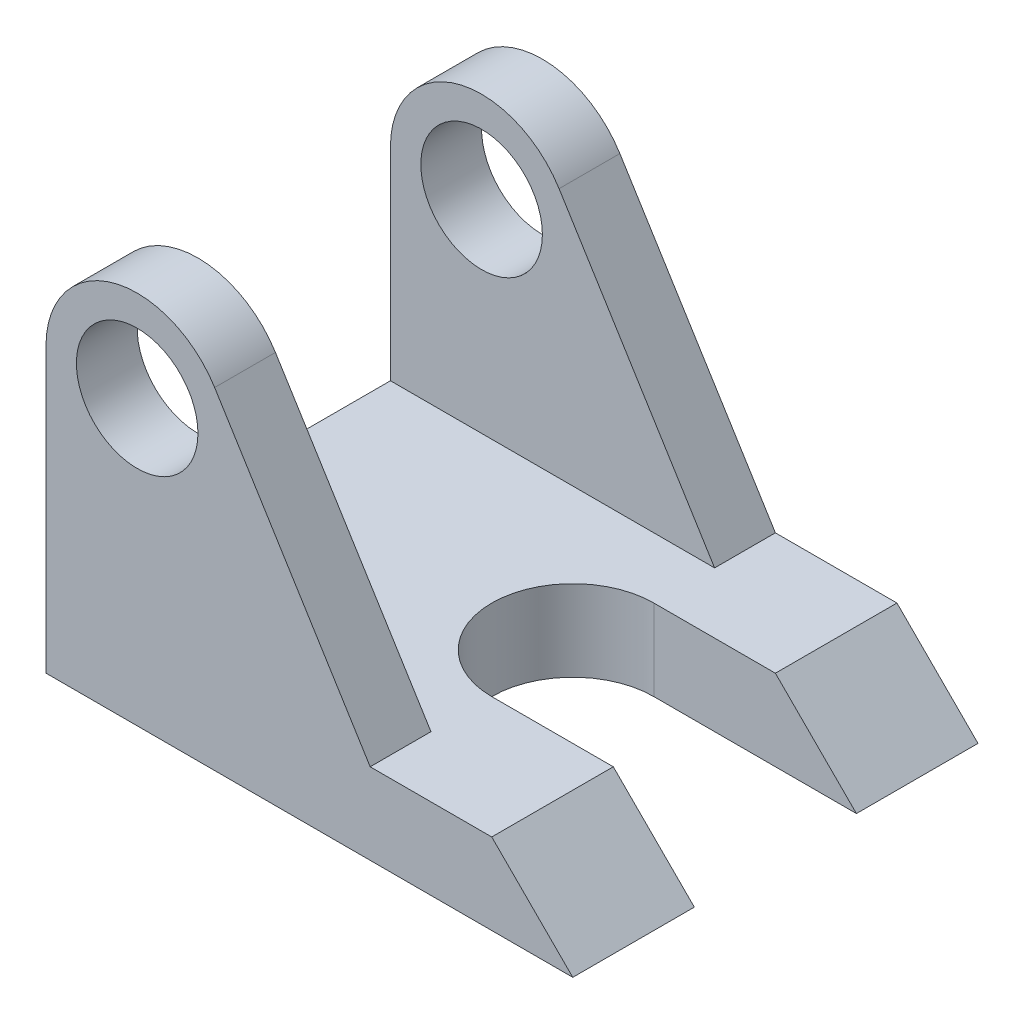
ISO-10303-21;
HEADER;
FILE_DESCRIPTION(('STEP AP214'),'2;1');
FILE_NAME('part.step','',(''),(''),'','','');
FILE_SCHEMA(('AUTOMOTIVE_DESIGN { 1 0 10303 214 1 1 1 1 }'));
ENDSEC;
DATA;
#1=APPLICATION_CONTEXT('core data for automotive mechanical design processes');
#2=APPLICATION_PROTOCOL_DEFINITION('international standard','automotive_design',2000,#1);
#3=PRODUCT_CONTEXT('',#1,'mechanical');
#4=PRODUCT('Part','Part','',(#3));
#5=PRODUCT_RELATED_PRODUCT_CATEGORY('part','',(#4));
#6=PRODUCT_DEFINITION_FORMATION('','',#4);
#7=PRODUCT_DEFINITION_CONTEXT('part definition',#1,'design');
#8=PRODUCT_DEFINITION('design','',#6,#7);
#9=PRODUCT_DEFINITION_SHAPE('','',#8);
#10=(LENGTH_UNIT() NAMED_UNIT(*) SI_UNIT(.MILLI.,.METRE.));
#11=(NAMED_UNIT(*) PLANE_ANGLE_UNIT() SI_UNIT($,.RADIAN.));
#12=(NAMED_UNIT(*) SI_UNIT($,.STERADIAN.) SOLID_ANGLE_UNIT());
#13=UNCERTAINTY_MEASURE_WITH_UNIT(LENGTH_MEASURE(1.E-05),#10,'distance_accuracy_value','');
#14=(GEOMETRIC_REPRESENTATION_CONTEXT(3) GLOBAL_UNCERTAINTY_ASSIGNED_CONTEXT((#13)) GLOBAL_UNIT_ASSIGNED_CONTEXT((#10,
#11,#12)) REPRESENTATION_CONTEXT('',''));
#15=CARTESIAN_POINT('',(0.,0.,0.));
#16=DIRECTION('',(0.,0.,1.));
#17=DIRECTION('',(1.,0.,0.));
#18=AXIS2_PLACEMENT_3D('',#15,#16,#17);
#19=CARTESIAN_POINT('',(0.,0.,50.));
#20=DIRECTION('',(0.,-1.,0.));
#21=DIRECTION('',(1.,0.,0.));
#22=AXIS2_PLACEMENT_3D('',#19,#20,#21);
#23=PLANE('',#22);
#24=DIRECTION('',(-1.,0.,0.));
#25=VECTOR('',#24,1.);
#26=CARTESIAN_POINT('',(0.,0.,20.));
#27=LINE('',#26,#25);
#28=CARTESIAN_POINT('',(130.,0.,20.));
#29=VERTEX_POINT('',#28);
#30=CARTESIAN_POINT('',(80.,0.,20.));
#31=VERTEX_POINT('',#30);
#32=EDGE_CURVE('E74',#29,#31,#27,.T.);
#33=ORIENTED_EDGE('',*,*,#32,.F.);
#34=DIRECTION('',(0.,0.,-1.));
#35=VECTOR('',#34,1.);
#36=CARTESIAN_POINT('',(130.,0.,50.));
#37=LINE('',#36,#35);
#38=CARTESIAN_POINT('',(130.,0.,50.));
#39=VERTEX_POINT('',#38);
#40=EDGE_CURVE('E238',#39,#29,#37,.T.);
#41=ORIENTED_EDGE('',*,*,#40,.F.);
#42=DIRECTION('',(-1.,0.,0.));
#43=VECTOR('',#42,1.);
#44=CARTESIAN_POINT('',(0.,0.,50.));
#45=LINE('',#44,#43);
#46=CARTESIAN_POINT('',(0.,0.,50.));
#47=VERTEX_POINT('',#46);
#48=EDGE_CURVE('E217',#39,#47,#45,.T.);
#49=ORIENTED_EDGE('',*,*,#48,.T.);
#50=DIRECTION('',(0.,0.,-1.));
#51=VECTOR('',#50,1.);
#52=CARTESIAN_POINT('',(0.,0.,50.));
#53=LINE('',#52,#51);
#54=CARTESIAN_POINT('',(0.,0.,-50.));
#55=VERTEX_POINT('',#54);
#56=EDGE_CURVE('E241',#47,#55,#53,.T.);
#57=ORIENTED_EDGE('',*,*,#56,.T.);
#58=DIRECTION('',(-1.,0.,0.));
#59=VECTOR('',#58,1.);
#60=CARTESIAN_POINT('',(0.,0.,-50.));
#61=LINE('',#60,#59);
#62=CARTESIAN_POINT('',(130.,0.,-50.));
#63=VERTEX_POINT('',#62);
#64=EDGE_CURVE('E226',#63,#55,#61,.T.);
#65=ORIENTED_EDGE('',*,*,#64,.F.);
#66=CARTESIAN_POINT('',(130.,0.,-20.));
#67=VERTEX_POINT('',#66);
#68=EDGE_CURVE('E237',#67,#63,#37,.T.);
#69=ORIENTED_EDGE('',*,*,#68,.F.);
#70=DIRECTION('',(1.,0.,0.));
#71=VECTOR('',#70,1.);
#72=CARTESIAN_POINT('',(0.,0.,-20.));
#73=LINE('',#72,#71);
#74=CARTESIAN_POINT('',(80.,0.,-20.));
#75=VERTEX_POINT('',#74);
#76=EDGE_CURVE('E257',#75,#67,#73,.T.);
#77=ORIENTED_EDGE('',*,*,#76,.F.);
#78=CARTESIAN_POINT('',(80.,0.,0.));
#79=DIRECTION('',(0.,-1.,0.));
#80=DIRECTION('',(0.,0.,-1.));
#81=AXIS2_PLACEMENT_3D('',#78,#79,#80);
#82=CIRCLE('',#81,20.);
#83=EDGE_CURVE('E45',#75,#31,#82,.F.);
#84=ORIENTED_EDGE('',*,*,#83,.T.);
#85=EDGE_LOOP('',(#33,#41,#49,#57,#65,#69,#77,#84));
#86=FACE_BOUND('',#85,.T.);
#87=ADVANCED_FACE('F41',(#86),#23,.T.);
#88=CARTESIAN_POINT('',(64.9999999999999,65.,50.));
#89=DIRECTION('',(0.707106781186547,0.707106781186548,0.));
#90=DIRECTION('',(-0.707106781186548,0.707106781186547,0.));
#91=AXIS2_PLACEMENT_3D('',#88,#89,#90);
#92=PLANE('',#91);
#93=DIRECTION('',(0.707106781186548,-0.707106781186547,0.));
#94=VECTOR('',#93,1.);
#95=CARTESIAN_POINT('',(64.9999999999999,65.,20.));
#96=LINE('',#95,#94);
#97=CARTESIAN_POINT('',(110.,20.,20.));
#98=VERTEX_POINT('',#97);
#99=EDGE_CURVE('E252',#98,#29,#96,.T.);
#100=ORIENTED_EDGE('',*,*,#99,.F.);
#101=DIRECTION('',(0.,0.,-1.));
#102=VECTOR('',#101,1.);
#103=CARTESIAN_POINT('',(110.,20.,50.));
#104=LINE('',#103,#102);
#105=CARTESIAN_POINT('',(110.,20.,50.));
#106=VERTEX_POINT('',#105);
#107=EDGE_CURVE('E234',#106,#98,#104,.T.);
#108=ORIENTED_EDGE('',*,*,#107,.F.);
#109=DIRECTION('',(0.707106781186548,-0.707106781186547,0.));
#110=VECTOR('',#109,1.);
#111=CARTESIAN_POINT('',(64.9999999999999,65.,50.));
#112=LINE('',#111,#110);
#113=EDGE_CURVE('E221',#106,#39,#112,.T.);
#114=ORIENTED_EDGE('',*,*,#113,.T.);
#115=ORIENTED_EDGE('',*,*,#40,.T.);
#116=EDGE_LOOP('',(#100,#108,#114,#115));
#117=FACE_BOUND('',#116,.T.);
#118=ADVANCED_FACE('F255',(#117),#92,.T.);
#119=CARTESIAN_POINT('',(0.,20.,50.));
#120=DIRECTION('',(0.,1.,0.));
#121=DIRECTION('',(0.,0.,1.));
#122=AXIS2_PLACEMENT_3D('',#119,#120,#121);
#123=PLANE('',#122);
#124=DIRECTION('',(1.,0.,0.));
#125=VECTOR('',#124,1.);
#126=CARTESIAN_POINT('',(0.,20.,20.));
#127=LINE('',#126,#125);
#128=CARTESIAN_POINT('',(80.,20.,20.));
#129=VERTEX_POINT('',#128);
#130=EDGE_CURVE('E11',#129,#98,#127,.T.);
#131=ORIENTED_EDGE('',*,*,#130,.F.);
#132=CARTESIAN_POINT('',(80.,20.,0.));
#133=DIRECTION('',(0.,1.,0.));
#134=DIRECTION('',(0.,0.,1.));
#135=AXIS2_PLACEMENT_3D('',#132,#133,#134);
#136=CIRCLE('',#135,20.);
#137=CARTESIAN_POINT('',(80.,20.,-20.));
#138=VERTEX_POINT('',#137);
#139=EDGE_CURVE('E79',#129,#138,#136,.F.);
#140=ORIENTED_EDGE('',*,*,#139,.T.);
#141=DIRECTION('',(-1.,0.,0.));
#142=VECTOR('',#141,1.);
#143=CARTESIAN_POINT('',(0.,20.,-20.));
#144=LINE('',#143,#142);
#145=CARTESIAN_POINT('',(110.,20.,-20.));
#146=VERTEX_POINT('',#145);
#147=EDGE_CURVE('E51',#146,#138,#144,.T.);
#148=ORIENTED_EDGE('',*,*,#147,.F.);
#149=CARTESIAN_POINT('',(110.,20.,-50.));
#150=VERTEX_POINT('',#149);
#151=EDGE_CURVE('E157',#146,#150,#104,.T.);
#152=ORIENTED_EDGE('',*,*,#151,.T.);
#153=DIRECTION('',(1.,0.,0.));
#154=VECTOR('',#153,1.);
#155=CARTESIAN_POINT('',(0.,20.,-50.));
#156=LINE('',#155,#154);
#157=CARTESIAN_POINT('',(80.,20.,-50.));
#158=VERTEX_POINT('',#157);
#159=EDGE_CURVE('E218',#158,#150,#156,.T.);
#160=ORIENTED_EDGE('',*,*,#159,.F.);
#161=DIRECTION('',(0.,0.,1.));
#162=VECTOR('',#161,1.);
#163=CARTESIAN_POINT('',(80.,20.,-50.));
#164=LINE('',#163,#162);
#165=CARTESIAN_POINT('',(80.,20.,-35.));
#166=VERTEX_POINT('',#165);
#167=EDGE_CURVE('E211',#158,#166,#164,.T.);
#168=ORIENTED_EDGE('',*,*,#167,.T.);
#169=DIRECTION('',(1.,0.,0.));
#170=VECTOR('',#169,1.);
#171=CARTESIAN_POINT('',(0.,20.,-35.));
#172=LINE('',#171,#170);
#173=CARTESIAN_POINT('',(0.,20.,-35.));
#174=VERTEX_POINT('',#173);
#175=EDGE_CURVE('E153',#174,#166,#172,.T.);
#176=ORIENTED_EDGE('',*,*,#175,.F.);
#177=DIRECTION('',(0.,0.,-1.));
#178=VECTOR('',#177,1.);
#179=CARTESIAN_POINT('',(0.,20.,50.));
#180=LINE('',#179,#178);
#181=CARTESIAN_POINT('',(0.,20.,35.));
#182=VERTEX_POINT('',#181);
#183=EDGE_CURVE('E145',#182,#174,#180,.T.);
#184=ORIENTED_EDGE('',*,*,#183,.F.);
#185=DIRECTION('',(1.,0.,0.));
#186=VECTOR('',#185,1.);
#187=CARTESIAN_POINT('',(0.,20.,35.));
#188=LINE('',#187,#186);
#189=CARTESIAN_POINT('',(80.,20.,35.));
#190=VERTEX_POINT('',#189);
#191=EDGE_CURVE('E150',#182,#190,#188,.T.);
#192=ORIENTED_EDGE('',*,*,#191,.T.);
#193=DIRECTION('',(0.,0.,-1.));
#194=VECTOR('',#193,1.);
#195=CARTESIAN_POINT('',(80.,20.,50.));
#196=LINE('',#195,#194);
#197=CARTESIAN_POINT('',(80.,20.,50.));
#198=VERTEX_POINT('',#197);
#199=EDGE_CURVE('E182',#198,#190,#196,.T.);
#200=ORIENTED_EDGE('',*,*,#199,.F.);
#201=DIRECTION('',(1.,0.,0.));
#202=VECTOR('',#201,1.);
#203=CARTESIAN_POINT('',(0.,20.,50.));
#204=LINE('',#203,#202);
#205=EDGE_CURVE('E158',#198,#106,#204,.T.);
#206=ORIENTED_EDGE('',*,*,#205,.T.);
#207=ORIENTED_EDGE('',*,*,#107,.T.);
#208=EDGE_LOOP('',(#131,#140,#148,#152,#160,#168,#176,#184,#192,#200,#206,#207));
#209=FACE_BOUND('',#208,.T.);
#210=ADVANCED_FACE('F148',(#209),#123,.T.);
#211=CARTESIAN_POINT('',(0.,0.,50.));
#212=DIRECTION('',(-1.,0.,0.));
#213=DIRECTION('',(0.,0.,1.));
#214=AXIS2_PLACEMENT_3D('',#211,#212,#213);
#215=PLANE('',#214);
#216=DIRECTION('',(0.,1.,0.));
#217=VECTOR('',#216,1.);
#218=CARTESIAN_POINT('',(0.,0.,-50.));
#219=LINE('',#218,#217);
#220=CARTESIAN_POINT('',(0.,70.,-50.));
#221=VERTEX_POINT('',#220);
#222=EDGE_CURVE('E210',#55,#221,#219,.T.);
#223=ORIENTED_EDGE('',*,*,#222,.F.);
#224=ORIENTED_EDGE('',*,*,#56,.F.);
#225=DIRECTION('',(0.,1.,0.));
#226=VECTOR('',#225,1.);
#227=CARTESIAN_POINT('',(0.,0.,50.));
#228=LINE('',#227,#226);
#229=CARTESIAN_POINT('',(0.,70.,50.));
#230=VERTEX_POINT('',#229);
#231=EDGE_CURVE('E215',#47,#230,#228,.T.);
#232=ORIENTED_EDGE('',*,*,#231,.T.);
#233=DIRECTION('',(0.,0.,-1.));
#234=VECTOR('',#233,1.);
#235=CARTESIAN_POINT('',(0.,70.,50.));
#236=LINE('',#235,#234);
#237=CARTESIAN_POINT('',(0.,70.,35.));
#238=VERTEX_POINT('',#237);
#239=EDGE_CURVE('E171',#230,#238,#236,.T.);
#240=ORIENTED_EDGE('',*,*,#239,.T.);
#241=DIRECTION('',(0.,1.,0.));
#242=VECTOR('',#241,1.);
#243=CARTESIAN_POINT('',(0.,0.,35.));
#244=LINE('',#243,#242);
#245=EDGE_CURVE('E165',#182,#238,#244,.T.);
#246=ORIENTED_EDGE('',*,*,#245,.F.);
#247=ORIENTED_EDGE('',*,*,#183,.T.);
#248=DIRECTION('',(0.,1.,0.));
#249=VECTOR('',#248,1.);
#250=CARTESIAN_POINT('',(0.,0.,-35.));
#251=LINE('',#250,#249);
#252=CARTESIAN_POINT('',(0.,70.,-35.));
#253=VERTEX_POINT('',#252);
#254=EDGE_CURVE('E202',#174,#253,#251,.T.);
#255=ORIENTED_EDGE('',*,*,#254,.T.);
#256=DIRECTION('',(0.,0.,1.));
#257=VECTOR('',#256,1.);
#258=CARTESIAN_POINT('',(0.,70.,-50.));
#259=LINE('',#258,#257);
#260=EDGE_CURVE('E196',#221,#253,#259,.T.);
#261=ORIENTED_EDGE('',*,*,#260,.F.);
#262=EDGE_LOOP('',(#223,#224,#232,#240,#246,#247,#255,#261));
#263=FACE_BOUND('',#262,.T.);
#264=ADVANCED_FACE('F43',(#263),#215,.T.);
#265=DIRECTION('',(-0.707106781186548,0.707106781186547,0.));
#266=VECTOR('',#265,1.);
#267=CARTESIAN_POINT('',(64.9999999999999,65.,-20.));
#268=LINE('',#267,#266);
#269=EDGE_CURVE('E247',#67,#146,#268,.T.);
#270=ORIENTED_EDGE('',*,*,#269,.F.);
#271=ORIENTED_EDGE('',*,*,#68,.T.);
#272=DIRECTION('',(0.707106781186548,-0.707106781186547,0.));
#273=VECTOR('',#272,1.);
#274=CARTESIAN_POINT('',(64.9999999999999,65.,-50.));
#275=LINE('',#274,#273);
#276=EDGE_CURVE('E229',#150,#63,#275,.T.);
#277=ORIENTED_EDGE('',*,*,#276,.F.);
#278=ORIENTED_EDGE('',*,*,#151,.F.);
#279=EDGE_LOOP('',(#270,#271,#277,#278));
#280=FACE_BOUND('',#279,.T.);
#281=ADVANCED_FACE('F303',(#280),#92,.T.);
#282=CARTESIAN_POINT('',(0.,0.,50.));
#283=DIRECTION('',(0.,0.,1.));
#284=DIRECTION('',(1.,0.,0.));
#285=AXIS2_PLACEMENT_3D('',#282,#283,#284);
#286=PLANE('',#285);
#287=ORIENTED_EDGE('',*,*,#231,.F.);
#288=ORIENTED_EDGE('',*,*,#48,.F.);
#289=ORIENTED_EDGE('',*,*,#113,.F.);
#290=ORIENTED_EDGE('',*,*,#205,.F.);
#291=DIRECTION('',(0.527201409917985,-0.849740356450421,0.));
#292=VECTOR('',#291,1.);
#293=CARTESIAN_POINT('',(66.7243801501366,41.3975716511801,50.));
#294=LINE('',#293,#292);
#295=CARTESIAN_POINT('',(41.6191580201345,81.8620317231546,50.));
#296=VERTEX_POINT('',#295);
#297=EDGE_CURVE('E186',#296,#198,#294,.T.);
#298=ORIENTED_EDGE('',*,*,#297,.F.);
#299=CARTESIAN_POINT('',(22.5,70.,50.));
#300=DIRECTION('',(0.,0.,1.));
#301=DIRECTION('',(1.,0.,0.));
#302=AXIS2_PLACEMENT_3D('',#299,#300,#301);
#303=CIRCLE('',#302,22.5);
#304=EDGE_CURVE('E176',#230,#296,#303,.F.);
#305=ORIENTED_EDGE('',*,*,#304,.F.);
#306=EDGE_LOOP('',(#287,#288,#289,#290,#298,#305));
#307=FACE_BOUND('',#306,.T.);
#308=CARTESIAN_POINT('',(22.5,70.,50.));
#309=DIRECTION('',(0.,0.,1.));
#310=DIRECTION('',(1.,0.,0.));
#311=AXIS2_PLACEMENT_3D('',#308,#309,#310);
#312=CIRCLE('',#311,15.);
#313=CARTESIAN_POINT('',(37.5,70.,50.));
#314=VERTEX_POINT('',#313);
#315=EDGE_CURVE('E173',#314,#314,#312,.T.);
#316=ORIENTED_EDGE('',*,*,#315,.F.);
#317=EDGE_LOOP('',(#316));
#318=FACE_BOUND('',#317,.T.);
#319=ADVANCED_FACE('F279',(#307,#318),#286,.T.);
#320=CARTESIAN_POINT('',(0.,0.,-50.));
#321=DIRECTION('',(0.,0.,1.));
#322=DIRECTION('',(1.,0.,0.));
#323=AXIS2_PLACEMENT_3D('',#320,#321,#322);
#324=PLANE('',#323);
#325=ORIENTED_EDGE('',*,*,#222,.T.);
#326=CARTESIAN_POINT('',(22.5,70.,-50.));
#327=DIRECTION('',(0.,0.,1.));
#328=DIRECTION('',(1.,0.,0.));
#329=AXIS2_PLACEMENT_3D('',#326,#327,#328);
#330=CIRCLE('',#329,22.5);
#331=CARTESIAN_POINT('',(41.6191580201345,81.8620317231546,-50.));
#332=VERTEX_POINT('',#331);
#333=EDGE_CURVE('E190',#221,#332,#330,.F.);
#334=ORIENTED_EDGE('',*,*,#333,.T.);
#335=DIRECTION('',(0.527201409917985,-0.849740356450421,0.));
#336=VECTOR('',#335,1.);
#337=CARTESIAN_POINT('',(66.7243801501366,41.3975716511801,-50.));
#338=LINE('',#337,#336);
#339=EDGE_CURVE('E194',#332,#158,#338,.T.);
#340=ORIENTED_EDGE('',*,*,#339,.T.);
#341=ORIENTED_EDGE('',*,*,#159,.T.);
#342=ORIENTED_EDGE('',*,*,#276,.T.);
#343=ORIENTED_EDGE('',*,*,#64,.T.);
#344=EDGE_LOOP('',(#325,#334,#340,#341,#342,#343));
#345=FACE_BOUND('',#344,.T.);
#346=CARTESIAN_POINT('',(22.5,70.,-50.));
#347=DIRECTION('',(0.,0.,1.));
#348=DIRECTION('',(1.,0.,0.));
#349=AXIS2_PLACEMENT_3D('',#346,#347,#348);
#350=CIRCLE('',#349,15.);
#351=CARTESIAN_POINT('',(37.5,70.,-50.));
#352=VERTEX_POINT('',#351);
#353=EDGE_CURVE('E187',#352,#352,#350,.T.);
#354=ORIENTED_EDGE('',*,*,#353,.T.);
#355=EDGE_LOOP('',(#354));
#356=FACE_BOUND('',#355,.T.);
#357=ADVANCED_FACE('F309',(#345,#356),#324,.F.);
#358=CARTESIAN_POINT('',(22.5,70.,-50.));
#359=DIRECTION('',(0.,0.,1.));
#360=DIRECTION('',(1.,0.,0.));
#361=AXIS2_PLACEMENT_3D('',#358,#359,#360);
#362=CYLINDRICAL_SURFACE('',#361,22.5);
#363=CARTESIAN_POINT('',(22.5,70.,-35.));
#364=DIRECTION('',(0.,0.,1.));
#365=DIRECTION('',(1.,0.,0.));
#366=AXIS2_PLACEMENT_3D('',#363,#364,#365);
#367=CIRCLE('',#366,22.5);
#368=CARTESIAN_POINT('',(41.6191580201345,81.8620317231546,-35.));
#369=VERTEX_POINT('',#368);
#370=EDGE_CURVE('E199',#253,#369,#367,.F.);
#371=ORIENTED_EDGE('',*,*,#370,.T.);
#372=DIRECTION('',(0.,0.,1.));
#373=VECTOR('',#372,1.);
#374=CARTESIAN_POINT('',(41.6191580201345,81.8620317231546,-50.));
#375=LINE('',#374,#373);
#376=EDGE_CURVE('E207',#332,#369,#375,.T.);
#377=ORIENTED_EDGE('',*,*,#376,.F.);
#378=ORIENTED_EDGE('',*,*,#333,.F.);
#379=ORIENTED_EDGE('',*,*,#260,.T.);
#380=EDGE_LOOP('',(#371,#377,#378,#379));
#381=FACE_BOUND('',#380,.T.);
#382=ADVANCED_FACE('F312',(#381),#362,.T.);
#383=CARTESIAN_POINT('',(66.7243801501366,41.3975716511801,-50.));
#384=DIRECTION('',(-0.849740356450421,-0.527201409917985,0.));
#385=DIRECTION('',(0.527201409917985,-0.849740356450421,0.));
#386=AXIS2_PLACEMENT_3D('',#383,#384,#385);
#387=PLANE('',#386);
#388=DIRECTION('',(0.527201409917985,-0.849740356450421,0.));
#389=VECTOR('',#388,1.);
#390=CARTESIAN_POINT('',(66.7243801501366,41.3975716511801,-35.));
#391=LINE('',#390,#389);
#392=EDGE_CURVE('E191',#369,#166,#391,.T.);
#393=ORIENTED_EDGE('',*,*,#392,.T.);
#394=ORIENTED_EDGE('',*,*,#167,.F.);
#395=ORIENTED_EDGE('',*,*,#339,.F.);
#396=ORIENTED_EDGE('',*,*,#376,.T.);
#397=EDGE_LOOP('',(#393,#394,#395,#396));
#398=FACE_BOUND('',#397,.T.);
#399=ADVANCED_FACE('F320',(#398),#387,.F.);
#400=CARTESIAN_POINT('',(22.5,70.,-50.));
#401=DIRECTION('',(0.,0.,1.));
#402=DIRECTION('',(1.,0.,0.));
#403=AXIS2_PLACEMENT_3D('',#400,#401,#402);
#404=CYLINDRICAL_SURFACE('',#403,15.);
#405=ORIENTED_EDGE('',*,*,#353,.F.);
#406=EDGE_LOOP('',(#405));
#407=FACE_BOUND('',#406,.T.);
#408=CARTESIAN_POINT('',(22.5,70.,-35.));
#409=DIRECTION('',(0.,0.,1.));
#410=DIRECTION('',(1.,0.,0.));
#411=AXIS2_PLACEMENT_3D('',#408,#409,#410);
#412=CIRCLE('',#411,15.);
#413=CARTESIAN_POINT('',(37.5,70.,-35.));
#414=VERTEX_POINT('',#413);
#415=EDGE_CURVE('E181',#414,#414,#412,.T.);
#416=ORIENTED_EDGE('',*,*,#415,.T.);
#417=EDGE_LOOP('',(#416));
#418=FACE_BOUND('',#417,.T.);
#419=ADVANCED_FACE('F316',(#407,#418),#404,.F.);
#420=CARTESIAN_POINT('',(0.,0.,-35.));
#421=DIRECTION('',(0.,0.,1.));
#422=DIRECTION('',(1.,0.,0.));
#423=AXIS2_PLACEMENT_3D('',#420,#421,#422);
#424=PLANE('',#423);
#425=ORIENTED_EDGE('',*,*,#415,.F.);
#426=EDGE_LOOP('',(#425));
#427=FACE_BOUND('',#426,.T.);
#428=ORIENTED_EDGE('',*,*,#370,.F.);
#429=ORIENTED_EDGE('',*,*,#254,.F.);
#430=ORIENTED_EDGE('',*,*,#175,.T.);
#431=ORIENTED_EDGE('',*,*,#392,.F.);
#432=EDGE_LOOP('',(#428,#429,#430,#431));
#433=FACE_BOUND('',#432,.T.);
#434=ADVANCED_FACE('F319',(#427,#433),#424,.T.);
#435=CARTESIAN_POINT('',(22.5,70.,50.));
#436=DIRECTION('',(0.,0.,-1.));
#437=DIRECTION('',(-1.,0.,0.));
#438=AXIS2_PLACEMENT_3D('',#435,#436,#437);
#439=CYLINDRICAL_SURFACE('',#438,22.5);
#440=CARTESIAN_POINT('',(22.5,70.,35.));
#441=DIRECTION('',(0.,0.,1.));
#442=DIRECTION('',(1.,0.,0.));
#443=AXIS2_PLACEMENT_3D('',#440,#441,#442);
#444=CIRCLE('',#443,22.5);
#445=CARTESIAN_POINT('',(41.6191580201345,81.8620317231546,35.));
#446=VERTEX_POINT('',#445);
#447=EDGE_CURVE('E270',#238,#446,#444,.F.);
#448=ORIENTED_EDGE('',*,*,#447,.F.);
#449=ORIENTED_EDGE('',*,*,#239,.F.);
#450=ORIENTED_EDGE('',*,*,#304,.T.);
#451=DIRECTION('',(0.,0.,-1.));
#452=VECTOR('',#451,1.);
#453=CARTESIAN_POINT('',(41.6191580201345,81.8620317231546,50.));
#454=LINE('',#453,#452);
#455=EDGE_CURVE('E184',#296,#446,#454,.T.);
#456=ORIENTED_EDGE('',*,*,#455,.T.);
#457=EDGE_LOOP('',(#448,#449,#450,#456));
#458=FACE_BOUND('',#457,.T.);
#459=ADVANCED_FACE('F272',(#458),#439,.T.);
#460=CARTESIAN_POINT('',(22.5,70.,50.));
#461=DIRECTION('',(0.,0.,-1.));
#462=DIRECTION('',(-1.,0.,0.));
#463=AXIS2_PLACEMENT_3D('',#460,#461,#462);
#464=CYLINDRICAL_SURFACE('',#463,15.);
#465=ORIENTED_EDGE('',*,*,#315,.T.);
#466=EDGE_LOOP('',(#465));
#467=FACE_BOUND('',#466,.T.);
#468=CARTESIAN_POINT('',(22.5,70.,35.));
#469=DIRECTION('',(0.,0.,1.));
#470=DIRECTION('',(1.,0.,0.));
#471=AXIS2_PLACEMENT_3D('',#468,#469,#470);
#472=CIRCLE('',#471,15.);
#473=CARTESIAN_POINT('',(37.5,70.,35.));
#474=VERTEX_POINT('',#473);
#475=EDGE_CURVE('E259',#474,#474,#472,.T.);
#476=ORIENTED_EDGE('',*,*,#475,.F.);
#477=EDGE_LOOP('',(#476));
#478=FACE_BOUND('',#477,.T.);
#479=ADVANCED_FACE('F331',(#467,#478),#464,.F.);
#480=CARTESIAN_POINT('',(66.7243801501366,41.3975716511801,50.));
#481=DIRECTION('',(0.849740356450421,0.527201409917985,0.));
#482=DIRECTION('',(-0.527201409917985,0.849740356450421,0.));
#483=AXIS2_PLACEMENT_3D('',#480,#481,#482);
#484=PLANE('',#483);
#485=DIRECTION('',(0.527201409917985,-0.849740356450421,0.));
#486=VECTOR('',#485,1.);
#487=CARTESIAN_POINT('',(66.7243801501366,41.3975716511801,35.));
#488=LINE('',#487,#486);
#489=EDGE_CURVE('E167',#446,#190,#488,.T.);
#490=ORIENTED_EDGE('',*,*,#489,.F.);
#491=ORIENTED_EDGE('',*,*,#455,.F.);
#492=ORIENTED_EDGE('',*,*,#297,.T.);
#493=ORIENTED_EDGE('',*,*,#199,.T.);
#494=EDGE_LOOP('',(#490,#491,#492,#493));
#495=FACE_BOUND('',#494,.T.);
#496=ADVANCED_FACE('F276',(#495),#484,.T.);
#497=CARTESIAN_POINT('',(0.,0.,35.));
#498=DIRECTION('',(0.,0.,-1.));
#499=DIRECTION('',(1.,0.,0.));
#500=AXIS2_PLACEMENT_3D('',#497,#498,#499);
#501=PLANE('',#500);
#502=ORIENTED_EDGE('',*,*,#475,.T.);
#503=EDGE_LOOP('',(#502));
#504=FACE_BOUND('',#503,.T.);
#505=ORIENTED_EDGE('',*,*,#447,.T.);
#506=ORIENTED_EDGE('',*,*,#489,.T.);
#507=ORIENTED_EDGE('',*,*,#191,.F.);
#508=ORIENTED_EDGE('',*,*,#245,.T.);
#509=EDGE_LOOP('',(#505,#506,#507,#508));
#510=FACE_BOUND('',#509,.T.);
#511=ADVANCED_FACE('F164',(#504,#510),#501,.T.);
#512=CARTESIAN_POINT('',(80.,-1.2E-05,20.));
#513=DIRECTION('',(0.,0.,1.));
#514=DIRECTION('',(1.,0.,0.));
#515=AXIS2_PLACEMENT_3D('',#512,#513,#514);
#516=PLANE('',#515);
#517=ORIENTED_EDGE('',*,*,#32,.T.);
#518=DIRECTION('',(0.,-1.,0.));
#519=VECTOR('',#518,1.);
#520=CARTESIAN_POINT('',(80.,92.5,20.));
#521=LINE('',#520,#519);
#522=EDGE_CURVE('E253',#129,#31,#521,.T.);
#523=ORIENTED_EDGE('',*,*,#522,.F.);
#524=ORIENTED_EDGE('',*,*,#130,.T.);
#525=ORIENTED_EDGE('',*,*,#99,.T.);
#526=EDGE_LOOP('',(#517,#523,#524,#525));
#527=FACE_BOUND('',#526,.T.);
#528=ADVANCED_FACE('F251',(#527),#516,.F.);
#529=CARTESIAN_POINT('',(130.,-1.2E-05,-20.));
#530=DIRECTION('',(0.,0.,-1.));
#531=DIRECTION('',(-1.,0.,0.));
#532=AXIS2_PLACEMENT_3D('',#529,#530,#531);
#533=PLANE('',#532);
#534=ORIENTED_EDGE('',*,*,#76,.T.);
#535=ORIENTED_EDGE('',*,*,#269,.T.);
#536=ORIENTED_EDGE('',*,*,#147,.T.);
#537=DIRECTION('',(0.,-1.,0.));
#538=VECTOR('',#537,1.);
#539=CARTESIAN_POINT('',(80.,92.5,-20.));
#540=LINE('',#539,#538);
#541=EDGE_CURVE('E59',#138,#75,#540,.T.);
#542=ORIENTED_EDGE('',*,*,#541,.T.);
#543=EDGE_LOOP('',(#534,#535,#536,#542));
#544=FACE_BOUND('',#543,.T.);
#545=ADVANCED_FACE('F245',(#544),#533,.F.);
#546=CARTESIAN_POINT('',(80.,92.5,0.));
#547=DIRECTION('',(0.,-1.,0.));
#548=DIRECTION('',(0.,0.,-1.));
#549=AXIS2_PLACEMENT_3D('',#546,#547,#548);
#550=CYLINDRICAL_SURFACE('',#549,20.);
#551=ORIENTED_EDGE('',*,*,#541,.F.);
#552=ORIENTED_EDGE('',*,*,#139,.F.);
#553=ORIENTED_EDGE('',*,*,#522,.T.);
#554=ORIENTED_EDGE('',*,*,#83,.F.);
#555=EDGE_LOOP('',(#551,#552,#553,#554));
#556=FACE_BOUND('',#555,.T.);
#557=ADVANCED_FACE('F289',(#556),#550,.F.);
#558=CLOSED_SHELL('',(#87,#118,#210,#264,#281,#319,#357,#382,#399,#419,#434,#459,#479,#496,#511,
#528,#545,#557));
#559=MANIFOLD_SOLID_BREP('B2',#558);
#560=ADVANCED_BREP_SHAPE_REPRESENTATION('',(#18,#559),#14);
#561=SHAPE_DEFINITION_REPRESENTATION(#9,#560);
ENDSEC;
END-ISO-10303-21;
